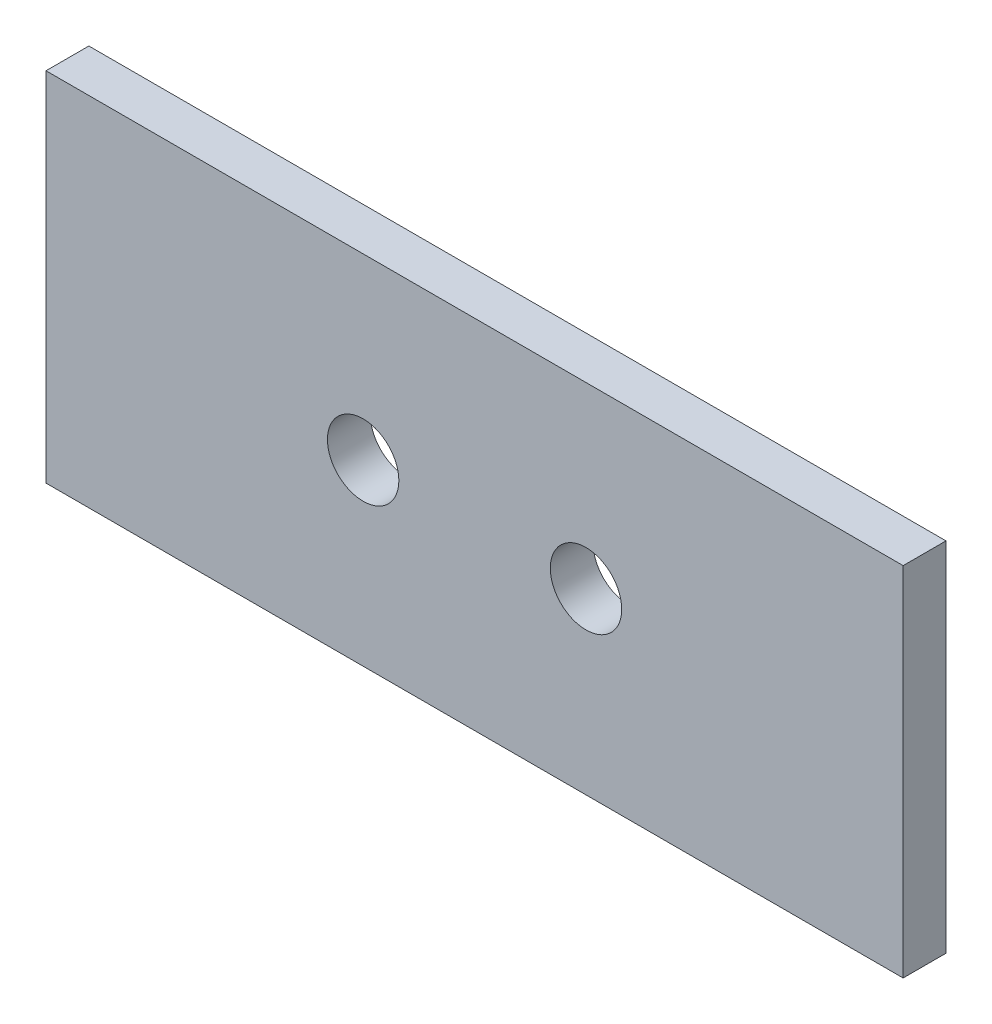
ISO-10303-21;
HEADER;
FILE_DESCRIPTION(('STEP AP214'),'2;1');
FILE_NAME('part.step','',(''),(''),'','','');
FILE_SCHEMA(('AUTOMOTIVE_DESIGN { 1 0 10303 214 1 1 1 1 }'));
ENDSEC;
DATA;
#1=APPLICATION_CONTEXT('core data for automotive mechanical design processes');
#2=APPLICATION_PROTOCOL_DEFINITION('international standard','automotive_design',2000,#1);
#3=PRODUCT_CONTEXT('',#1,'mechanical');
#4=PRODUCT('Part','Part','',(#3));
#5=PRODUCT_RELATED_PRODUCT_CATEGORY('part','',(#4));
#6=PRODUCT_DEFINITION_FORMATION('','',#4);
#7=PRODUCT_DEFINITION_CONTEXT('part definition',#1,'design');
#8=PRODUCT_DEFINITION('design','',#6,#7);
#9=PRODUCT_DEFINITION_SHAPE('','',#8);
#10=(LENGTH_UNIT() NAMED_UNIT(*) SI_UNIT(.MILLI.,.METRE.));
#11=(NAMED_UNIT(*) PLANE_ANGLE_UNIT() SI_UNIT($,.RADIAN.));
#12=(NAMED_UNIT(*) SI_UNIT($,.STERADIAN.) SOLID_ANGLE_UNIT());
#13=UNCERTAINTY_MEASURE_WITH_UNIT(LENGTH_MEASURE(1.E-05),#10,'distance_accuracy_value','');
#14=(GEOMETRIC_REPRESENTATION_CONTEXT(3) GLOBAL_UNCERTAINTY_ASSIGNED_CONTEXT((#13)) GLOBAL_UNIT_ASSIGNED_CONTEXT((#10,
#11,#12)) REPRESENTATION_CONTEXT('',''));
#15=CARTESIAN_POINT('',(0.,0.,0.));
#16=DIRECTION('',(0.,0.,1.));
#17=DIRECTION('',(1.,0.,0.));
#18=AXIS2_PLACEMENT_3D('',#15,#16,#17);
#19=CARTESIAN_POINT('',(-30.,12.5,1.5));
#20=DIRECTION('',(1.,0.,0.));
#21=DIRECTION('',(0.,0.,-1.));
#22=AXIS2_PLACEMENT_3D('',#19,#20,#21);
#23=PLANE('',#22);
#24=DIRECTION('',(0.,-1.,0.));
#25=VECTOR('',#24,1.);
#26=CARTESIAN_POINT('',(-30.,12.5,-1.5));
#27=LINE('',#26,#25);
#28=CARTESIAN_POINT('',(-30.,12.5,-1.5));
#29=VERTEX_POINT('',#28);
#30=CARTESIAN_POINT('',(-30.,-12.5,-1.5));
#31=VERTEX_POINT('',#30);
#32=EDGE_CURVE('E80',#29,#31,#27,.T.);
#33=ORIENTED_EDGE('',*,*,#32,.T.);
#34=DIRECTION('',(0.,0.,-1.));
#35=VECTOR('',#34,1.);
#36=CARTESIAN_POINT('',(-30.,-12.5,1.5));
#37=LINE('',#36,#35);
#38=CARTESIAN_POINT('',(-30.,-12.5,1.5));
#39=VERTEX_POINT('',#38);
#40=EDGE_CURVE('E11',#39,#31,#37,.T.);
#41=ORIENTED_EDGE('',*,*,#40,.F.);
#42=DIRECTION('',(0.,-1.,0.));
#43=VECTOR('',#42,1.);
#44=CARTESIAN_POINT('',(-30.,12.5,1.5));
#45=LINE('',#44,#43);
#46=CARTESIAN_POINT('',(-30.,12.5,1.5));
#47=VERTEX_POINT('',#46);
#48=EDGE_CURVE('E103',#47,#39,#45,.T.);
#49=ORIENTED_EDGE('',*,*,#48,.F.);
#50=DIRECTION('',(0.,0.,-1.));
#51=VECTOR('',#50,1.);
#52=CARTESIAN_POINT('',(-30.,12.5,1.5));
#53=LINE('',#52,#51);
#54=EDGE_CURVE('E92',#47,#29,#53,.T.);
#55=ORIENTED_EDGE('',*,*,#54,.T.);
#56=EDGE_LOOP('',(#33,#41,#49,#55));
#57=FACE_BOUND('',#56,.T.);
#58=ADVANCED_FACE('F34',(#57),#23,.F.);
#59=CARTESIAN_POINT('',(-30.,-12.5,1.5));
#60=DIRECTION('',(0.,1.,0.));
#61=DIRECTION('',(-1.,0.,0.));
#62=AXIS2_PLACEMENT_3D('',#59,#60,#61);
#63=PLANE('',#62);
#64=DIRECTION('',(1.,0.,0.));
#65=VECTOR('',#64,1.);
#66=CARTESIAN_POINT('',(-30.,-12.5,-1.5));
#67=LINE('',#66,#65);
#68=CARTESIAN_POINT('',(30.,-12.5,-1.5));
#69=VERTEX_POINT('',#68);
#70=EDGE_CURVE('E76',#31,#69,#67,.T.);
#71=ORIENTED_EDGE('',*,*,#70,.T.);
#72=DIRECTION('',(0.,0.,-1.));
#73=VECTOR('',#72,1.);
#74=CARTESIAN_POINT('',(30.,-12.5,1.5));
#75=LINE('',#74,#73);
#76=CARTESIAN_POINT('',(30.,-12.5,1.5));
#77=VERTEX_POINT('',#76);
#78=EDGE_CURVE('E42',#77,#69,#75,.T.);
#79=ORIENTED_EDGE('',*,*,#78,.F.);
#80=DIRECTION('',(1.,0.,0.));
#81=VECTOR('',#80,1.);
#82=CARTESIAN_POINT('',(-30.,-12.5,1.5));
#83=LINE('',#82,#81);
#84=EDGE_CURVE('E88',#39,#77,#83,.T.);
#85=ORIENTED_EDGE('',*,*,#84,.F.);
#86=ORIENTED_EDGE('',*,*,#40,.T.);
#87=EDGE_LOOP('',(#71,#79,#85,#86));
#88=FACE_BOUND('',#87,.T.);
#89=ADVANCED_FACE('F87',(#88),#63,.F.);
#90=CARTESIAN_POINT('',(30.,12.5,1.5));
#91=DIRECTION('',(-1.,0.,0.));
#92=DIRECTION('',(0.,-1.,0.));
#93=AXIS2_PLACEMENT_3D('',#90,#91,#92);
#94=PLANE('',#93);
#95=DIRECTION('',(0.,1.,0.));
#96=VECTOR('',#95,1.);
#97=CARTESIAN_POINT('',(30.,12.5,-1.5));
#98=LINE('',#97,#96);
#99=CARTESIAN_POINT('',(30.,12.5,-1.5));
#100=VERTEX_POINT('',#99);
#101=EDGE_CURVE('E81',#69,#100,#98,.T.);
#102=ORIENTED_EDGE('',*,*,#101,.T.);
#103=DIRECTION('',(0.,0.,-1.));
#104=VECTOR('',#103,1.);
#105=CARTESIAN_POINT('',(30.,12.5,1.5));
#106=LINE('',#105,#104);
#107=CARTESIAN_POINT('',(30.,12.5,1.5));
#108=VERTEX_POINT('',#107);
#109=EDGE_CURVE('E109',#108,#100,#106,.T.);
#110=ORIENTED_EDGE('',*,*,#109,.F.);
#111=DIRECTION('',(0.,1.,0.));
#112=VECTOR('',#111,1.);
#113=CARTESIAN_POINT('',(30.,12.5,1.5));
#114=LINE('',#113,#112);
#115=EDGE_CURVE('E55',#77,#108,#114,.T.);
#116=ORIENTED_EDGE('',*,*,#115,.F.);
#117=ORIENTED_EDGE('',*,*,#78,.T.);
#118=EDGE_LOOP('',(#102,#110,#116,#117));
#119=FACE_BOUND('',#118,.T.);
#120=ADVANCED_FACE('F113',(#119),#94,.F.);
#121=CARTESIAN_POINT('',(-30.,12.5,1.5));
#122=DIRECTION('',(0.,-1.,0.));
#123=DIRECTION('',(1.,0.,0.));
#124=AXIS2_PLACEMENT_3D('',#121,#122,#123);
#125=PLANE('',#124);
#126=DIRECTION('',(-1.,0.,0.));
#127=VECTOR('',#126,1.);
#128=CARTESIAN_POINT('',(-30.,12.5,-1.5));
#129=LINE('',#128,#127);
#130=EDGE_CURVE('E101',#100,#29,#129,.T.);
#131=ORIENTED_EDGE('',*,*,#130,.T.);
#132=ORIENTED_EDGE('',*,*,#54,.F.);
#133=DIRECTION('',(-1.,0.,0.));
#134=VECTOR('',#133,1.);
#135=CARTESIAN_POINT('',(-30.,12.5,1.5));
#136=LINE('',#135,#134);
#137=EDGE_CURVE('E50',#108,#47,#136,.T.);
#138=ORIENTED_EDGE('',*,*,#137,.F.);
#139=ORIENTED_EDGE('',*,*,#109,.T.);
#140=EDGE_LOOP('',(#131,#132,#138,#139));
#141=FACE_BOUND('',#140,.T.);
#142=ADVANCED_FACE('F115',(#141),#125,.F.);
#143=CARTESIAN_POINT('',(-30.,-12.5,1.5));
#144=DIRECTION('',(0.,0.,1.));
#145=DIRECTION('',(1.,0.,0.));
#146=AXIS2_PLACEMENT_3D('',#143,#144,#145);
#147=PLANE('',#146);
#148=CARTESIAN_POINT('',(7.8,0.,1.5));
#149=DIRECTION('',(0.,0.,1.));
#150=DIRECTION('',(1.,0.,0.));
#151=AXIS2_PLACEMENT_3D('',#148,#149,#150);
#152=CIRCLE('',#151,2.5);
#153=CARTESIAN_POINT('',(10.3,0.,1.5));
#154=VERTEX_POINT('',#153);
#155=EDGE_CURVE('E179',#154,#154,#152,.T.);
#156=ORIENTED_EDGE('',*,*,#155,.F.);
#157=EDGE_LOOP('',(#156));
#158=FACE_BOUND('',#157,.T.);
#159=CARTESIAN_POINT('',(-7.8,0.,1.5));
#160=DIRECTION('',(0.,0.,1.));
#161=DIRECTION('',(1.,0.,0.));
#162=AXIS2_PLACEMENT_3D('',#159,#160,#161);
#163=CIRCLE('',#162,2.5);
#164=CARTESIAN_POINT('',(-5.3,0.,1.5));
#165=VERTEX_POINT('',#164);
#166=EDGE_CURVE('E96',#165,#165,#163,.T.);
#167=ORIENTED_EDGE('',*,*,#166,.F.);
#168=EDGE_LOOP('',(#167));
#169=FACE_BOUND('',#168,.T.);
#170=ORIENTED_EDGE('',*,*,#48,.T.);
#171=ORIENTED_EDGE('',*,*,#84,.T.);
#172=ORIENTED_EDGE('',*,*,#115,.T.);
#173=ORIENTED_EDGE('',*,*,#137,.T.);
#174=EDGE_LOOP('',(#170,#171,#172,#173));
#175=FACE_BOUND('',#174,.T.);
#176=ADVANCED_FACE('F116',(#158,#169,#175),#147,.T.);
#177=CARTESIAN_POINT('',(-30.,-12.5,-1.5));
#178=DIRECTION('',(0.,0.,1.));
#179=DIRECTION('',(1.,0.,0.));
#180=AXIS2_PLACEMENT_3D('',#177,#178,#179);
#181=PLANE('',#180);
#182=CARTESIAN_POINT('',(7.8,0.,-1.5));
#183=DIRECTION('',(0.,0.,1.));
#184=DIRECTION('',(1.,0.,0.));
#185=AXIS2_PLACEMENT_3D('',#182,#183,#184);
#186=CIRCLE('',#185,2.5);
#187=CARTESIAN_POINT('',(10.3,0.,-1.5));
#188=VERTEX_POINT('',#187);
#189=EDGE_CURVE('E37',#188,#188,#186,.T.);
#190=ORIENTED_EDGE('',*,*,#189,.T.);
#191=EDGE_LOOP('',(#190));
#192=FACE_BOUND('',#191,.T.);
#193=CARTESIAN_POINT('',(-7.8,0.,-1.5));
#194=DIRECTION('',(0.,0.,1.));
#195=DIRECTION('',(1.,0.,0.));
#196=AXIS2_PLACEMENT_3D('',#193,#194,#195);
#197=CIRCLE('',#196,2.5);
#198=CARTESIAN_POINT('',(-5.3,0.,-1.5));
#199=VERTEX_POINT('',#198);
#200=EDGE_CURVE('E93',#199,#199,#197,.T.);
#201=ORIENTED_EDGE('',*,*,#200,.T.);
#202=EDGE_LOOP('',(#201));
#203=FACE_BOUND('',#202,.T.);
#204=ORIENTED_EDGE('',*,*,#32,.F.);
#205=ORIENTED_EDGE('',*,*,#130,.F.);
#206=ORIENTED_EDGE('',*,*,#101,.F.);
#207=ORIENTED_EDGE('',*,*,#70,.F.);
#208=EDGE_LOOP('',(#204,#205,#206,#207));
#209=FACE_BOUND('',#208,.T.);
#210=ADVANCED_FACE('F77',(#192,#203,#209),#181,.F.);
#211=CARTESIAN_POINT('',(-7.8,0.,-8.5));
#212=DIRECTION('',(0.,0.,1.));
#213=DIRECTION('',(1.,0.,0.));
#214=AXIS2_PLACEMENT_3D('',#211,#212,#213);
#215=CYLINDRICAL_SURFACE('',#214,2.5);
#216=ORIENTED_EDGE('',*,*,#166,.T.);
#217=EDGE_LOOP('',(#216));
#218=FACE_BOUND('',#217,.T.);
#219=ORIENTED_EDGE('',*,*,#200,.F.);
#220=EDGE_LOOP('',(#219));
#221=FACE_BOUND('',#220,.T.);
#222=ADVANCED_FACE('F124',(#218,#221),#215,.F.);
#223=CARTESIAN_POINT('',(7.8,0.,-8.5));
#224=DIRECTION('',(0.,0.,1.));
#225=DIRECTION('',(1.,0.,0.));
#226=AXIS2_PLACEMENT_3D('',#223,#224,#225);
#227=CYLINDRICAL_SURFACE('',#226,2.5);
#228=ORIENTED_EDGE('',*,*,#155,.T.);
#229=EDGE_LOOP('',(#228));
#230=FACE_BOUND('',#229,.T.);
#231=ORIENTED_EDGE('',*,*,#189,.F.);
#232=EDGE_LOOP('',(#231));
#233=FACE_BOUND('',#232,.T.);
#234=ADVANCED_FACE('F163',(#230,#233),#227,.F.);
#235=CLOSED_SHELL('',(#58,#89,#120,#142,#176,#210,#222,#234));
#236=MANIFOLD_SOLID_BREP('B2',#235);
#237=ADVANCED_BREP_SHAPE_REPRESENTATION('',(#18,#236),#14);
#238=SHAPE_DEFINITION_REPRESENTATION(#9,#237);
ENDSEC;
END-ISO-10303-21;
